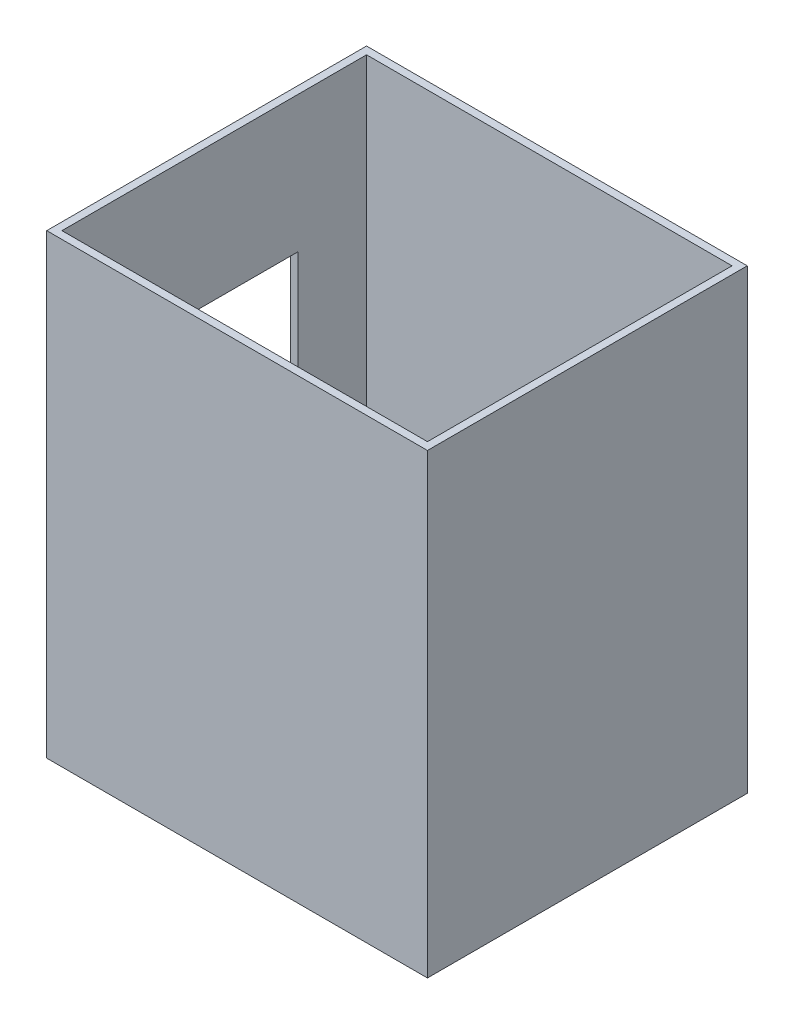
ISO-10303-21;
HEADER;
FILE_DESCRIPTION(('STEP AP214'),'2;1');
FILE_NAME('part.step','',(''),(''),'','','');
FILE_SCHEMA(('AUTOMOTIVE_DESIGN { 1 0 10303 214 1 1 1 1 }'));
ENDSEC;
DATA;
#1=APPLICATION_CONTEXT('core data for automotive mechanical design processes');
#2=APPLICATION_PROTOCOL_DEFINITION('international standard','automotive_design',2000,#1);
#3=PRODUCT_CONTEXT('',#1,'mechanical');
#4=PRODUCT('Part','Part','',(#3));
#5=PRODUCT_RELATED_PRODUCT_CATEGORY('part','',(#4));
#6=PRODUCT_DEFINITION_FORMATION('','',#4);
#7=PRODUCT_DEFINITION_CONTEXT('part definition',#1,'design');
#8=PRODUCT_DEFINITION('design','',#6,#7);
#9=PRODUCT_DEFINITION_SHAPE('','',#8);
#10=(LENGTH_UNIT() NAMED_UNIT(*) SI_UNIT(.MILLI.,.METRE.));
#11=(NAMED_UNIT(*) PLANE_ANGLE_UNIT() SI_UNIT($,.RADIAN.));
#12=(NAMED_UNIT(*) SI_UNIT($,.STERADIAN.) SOLID_ANGLE_UNIT());
#13=UNCERTAINTY_MEASURE_WITH_UNIT(LENGTH_MEASURE(1.E-05),#10,'distance_accuracy_value','');
#14=(GEOMETRIC_REPRESENTATION_CONTEXT(3) GLOBAL_UNCERTAINTY_ASSIGNED_CONTEXT((#13)) GLOBAL_UNIT_ASSIGNED_CONTEXT((#10,
#11,#12)) REPRESENTATION_CONTEXT('',''));
#15=CARTESIAN_POINT('',(0.,0.,0.));
#16=DIRECTION('',(0.,0.,1.));
#17=DIRECTION('',(1.,0.,0.));
#18=AXIS2_PLACEMENT_3D('',#15,#16,#17);
#19=CARTESIAN_POINT('',(-1250.,3000.,1050.));
#20=DIRECTION('',(1.,0.,0.));
#21=DIRECTION('',(0.,0.,-1.));
#22=AXIS2_PLACEMENT_3D('',#19,#20,#21);
#23=PLANE('',#22);
#24=DIRECTION('',(0.,0.,1.));
#25=VECTOR('',#24,1.);
#26=CARTESIAN_POINT('',(-1250.,4.99999999999989,-550.));
#27=LINE('',#26,#25);
#28=CARTESIAN_POINT('',(-1250.,4.99999999999989,-550.));
#29=VERTEX_POINT('',#28);
#30=CARTESIAN_POINT('',(-1250.,4.99999999999989,550.));
#31=VERTEX_POINT('',#30);
#32=EDGE_CURVE('E155',#29,#31,#27,.T.);
#33=ORIENTED_EDGE('',*,*,#32,.F.);
#34=DIRECTION('',(0.,-1.,0.));
#35=VECTOR('',#34,1.);
#36=CARTESIAN_POINT('',(-1250.,2105.,-550.));
#37=LINE('',#36,#35);
#38=CARTESIAN_POINT('',(-1250.,2105.,-550.));
#39=VERTEX_POINT('',#38);
#40=EDGE_CURVE('E47',#39,#29,#37,.T.);
#41=ORIENTED_EDGE('',*,*,#40,.F.);
#42=DIRECTION('',(0.,0.,-1.));
#43=VECTOR('',#42,1.);
#44=CARTESIAN_POINT('',(-1250.,2105.,-550.));
#45=LINE('',#44,#43);
#46=CARTESIAN_POINT('',(-1250.,2105.,550.));
#47=VERTEX_POINT('',#46);
#48=EDGE_CURVE('E136',#47,#39,#45,.T.);
#49=ORIENTED_EDGE('',*,*,#48,.F.);
#50=DIRECTION('',(0.,1.,0.));
#51=VECTOR('',#50,1.);
#52=CARTESIAN_POINT('',(-1250.,2105.,550.));
#53=LINE('',#52,#51);
#54=EDGE_CURVE('E157',#31,#47,#53,.T.);
#55=ORIENTED_EDGE('',*,*,#54,.F.);
#56=EDGE_LOOP('',(#33,#41,#49,#55));
#57=FACE_BOUND('',#56,.T.);
#58=DIRECTION('',(0.,0.,1.));
#59=VECTOR('',#58,1.);
#60=CARTESIAN_POINT('',(-1250.,0.,1050.));
#61=LINE('',#60,#59);
#62=CARTESIAN_POINT('',(-1250.,0.,-1050.));
#63=VERTEX_POINT('',#62);
#64=CARTESIAN_POINT('',(-1250.,0.,1050.));
#65=VERTEX_POINT('',#64);
#66=EDGE_CURVE('E175',#63,#65,#61,.T.);
#67=ORIENTED_EDGE('',*,*,#66,.T.);
#68=DIRECTION('',(0.,-1.,0.));
#69=VECTOR('',#68,1.);
#70=CARTESIAN_POINT('',(-1250.,3000.,1050.));
#71=LINE('',#70,#69);
#72=CARTESIAN_POINT('',(-1250.,3000.,1050.));
#73=VERTEX_POINT('',#72);
#74=EDGE_CURVE('E11',#73,#65,#71,.T.);
#75=ORIENTED_EDGE('',*,*,#74,.F.);
#76=DIRECTION('',(0.,0.,1.));
#77=VECTOR('',#76,1.);
#78=CARTESIAN_POINT('',(-1250.,3000.,1050.));
#79=LINE('',#78,#77);
#80=CARTESIAN_POINT('',(-1250.,3000.,-1050.));
#81=VERTEX_POINT('',#80);
#82=EDGE_CURVE('E199',#81,#73,#79,.T.);
#83=ORIENTED_EDGE('',*,*,#82,.F.);
#84=DIRECTION('',(0.,-1.,0.));
#85=VECTOR('',#84,1.);
#86=CARTESIAN_POINT('',(-1250.,3000.,-1050.));
#87=LINE('',#86,#85);
#88=EDGE_CURVE('E209',#81,#63,#87,.T.);
#89=ORIENTED_EDGE('',*,*,#88,.T.);
#90=EDGE_LOOP('',(#67,#75,#83,#89));
#91=FACE_BOUND('',#90,.T.);
#92=ADVANCED_FACE('F33',(#57,#91),#23,.F.);
#93=CARTESIAN_POINT('',(1250.,3000.,1050.));
#94=DIRECTION('',(0.,0.,-1.));
#95=DIRECTION('',(-1.,0.,0.));
#96=AXIS2_PLACEMENT_3D('',#93,#94,#95);
#97=PLANE('',#96);
#98=DIRECTION('',(1.,0.,0.));
#99=VECTOR('',#98,1.);
#100=CARTESIAN_POINT('',(1250.,0.,1050.));
#101=LINE('',#100,#99);
#102=CARTESIAN_POINT('',(1250.,0.,1050.));
#103=VERTEX_POINT('',#102);
#104=EDGE_CURVE('E212',#65,#103,#101,.T.);
#105=ORIENTED_EDGE('',*,*,#104,.T.);
#106=DIRECTION('',(0.,-1.,0.));
#107=VECTOR('',#106,1.);
#108=CARTESIAN_POINT('',(1250.,3000.,1050.));
#109=LINE('',#108,#107);
#110=CARTESIAN_POINT('',(1250.,3000.,1050.));
#111=VERTEX_POINT('',#110);
#112=EDGE_CURVE('E40',#111,#103,#109,.T.);
#113=ORIENTED_EDGE('',*,*,#112,.F.);
#114=DIRECTION('',(1.,0.,0.));
#115=VECTOR('',#114,1.);
#116=CARTESIAN_POINT('',(1250.,3000.,1050.));
#117=LINE('',#116,#115);
#118=EDGE_CURVE('E202',#73,#111,#117,.T.);
#119=ORIENTED_EDGE('',*,*,#118,.F.);
#120=ORIENTED_EDGE('',*,*,#74,.T.);
#121=EDGE_LOOP('',(#105,#113,#119,#120));
#122=FACE_BOUND('',#121,.T.);
#123=ADVANCED_FACE('F242',(#122),#97,.F.);
#124=CARTESIAN_POINT('',(1250.,3000.,1050.));
#125=DIRECTION('',(-1.,0.,0.));
#126=DIRECTION('',(0.,0.,1.));
#127=AXIS2_PLACEMENT_3D('',#124,#125,#126);
#128=PLANE('',#127);
#129=DIRECTION('',(0.,0.,-1.));
#130=VECTOR('',#129,1.);
#131=CARTESIAN_POINT('',(1250.,0.,1050.));
#132=LINE('',#131,#130);
#133=CARTESIAN_POINT('',(1250.,0.,-1050.));
#134=VERTEX_POINT('',#133);
#135=EDGE_CURVE('E214',#103,#134,#132,.T.);
#136=ORIENTED_EDGE('',*,*,#135,.T.);
#137=DIRECTION('',(0.,-1.,0.));
#138=VECTOR('',#137,1.);
#139=CARTESIAN_POINT('',(1250.,3000.,-1050.));
#140=LINE('',#139,#138);
#141=CARTESIAN_POINT('',(1250.,3000.,-1050.));
#142=VERTEX_POINT('',#141);
#143=EDGE_CURVE('E219',#142,#134,#140,.T.);
#144=ORIENTED_EDGE('',*,*,#143,.F.);
#145=DIRECTION('',(0.,0.,-1.));
#146=VECTOR('',#145,1.);
#147=CARTESIAN_POINT('',(1250.,3000.,1050.));
#148=LINE('',#147,#146);
#149=EDGE_CURVE('E205',#111,#142,#148,.T.);
#150=ORIENTED_EDGE('',*,*,#149,.F.);
#151=ORIENTED_EDGE('',*,*,#112,.T.);
#152=EDGE_LOOP('',(#136,#144,#150,#151));
#153=FACE_BOUND('',#152,.T.);
#154=ADVANCED_FACE('F226',(#153),#128,.F.);
#155=CARTESIAN_POINT('',(1250.,3000.,-1050.));
#156=DIRECTION('',(0.,0.,1.));
#157=DIRECTION('',(1.,0.,0.));
#158=AXIS2_PLACEMENT_3D('',#155,#156,#157);
#159=PLANE('',#158);
#160=DIRECTION('',(-1.,0.,0.));
#161=VECTOR('',#160,1.);
#162=CARTESIAN_POINT('',(1250.,0.,-1050.));
#163=LINE('',#162,#161);
#164=EDGE_CURVE('E203',#134,#63,#163,.T.);
#165=ORIENTED_EDGE('',*,*,#164,.T.);
#166=ORIENTED_EDGE('',*,*,#88,.F.);
#167=DIRECTION('',(-1.,0.,0.));
#168=VECTOR('',#167,1.);
#169=CARTESIAN_POINT('',(1250.,3000.,-1050.));
#170=LINE('',#169,#168);
#171=EDGE_CURVE('E207',#142,#81,#170,.T.);
#172=ORIENTED_EDGE('',*,*,#171,.F.);
#173=ORIENTED_EDGE('',*,*,#143,.T.);
#174=EDGE_LOOP('',(#165,#166,#172,#173));
#175=FACE_BOUND('',#174,.T.);
#176=ADVANCED_FACE('F235',(#175),#159,.F.);
#177=CARTESIAN_POINT('',(0.,3000.,0.));
#178=DIRECTION('',(0.,1.,0.));
#179=DIRECTION('',(0.,0.,1.));
#180=AXIS2_PLACEMENT_3D('',#177,#178,#179);
#181=PLANE('',#180);
#182=DIRECTION('',(0.,0.,1.));
#183=VECTOR('',#182,1.);
#184=CARTESIAN_POINT('',(-1200.,3000.,1050.));
#185=LINE('',#184,#183);
#186=CARTESIAN_POINT('',(-1200.,3000.,-1000.));
#187=VERTEX_POINT('',#186);
#188=CARTESIAN_POINT('',(-1200.,3000.,1000.));
#189=VERTEX_POINT('',#188);
#190=EDGE_CURVE('E191',#187,#189,#185,.T.);
#191=ORIENTED_EDGE('',*,*,#190,.F.);
#192=DIRECTION('',(-1.,0.,0.));
#193=VECTOR('',#192,1.);
#194=CARTESIAN_POINT('',(1250.,3000.,-1000.));
#195=LINE('',#194,#193);
#196=CARTESIAN_POINT('',(1200.,3000.,-1000.));
#197=VERTEX_POINT('',#196);
#198=EDGE_CURVE('E181',#197,#187,#195,.T.);
#199=ORIENTED_EDGE('',*,*,#198,.F.);
#200=DIRECTION('',(0.,0.,-1.));
#201=VECTOR('',#200,1.);
#202=CARTESIAN_POINT('',(1200.,3000.,1050.));
#203=LINE('',#202,#201);
#204=CARTESIAN_POINT('',(1200.,3000.,1000.));
#205=VERTEX_POINT('',#204);
#206=EDGE_CURVE('E195',#205,#197,#203,.T.);
#207=ORIENTED_EDGE('',*,*,#206,.F.);
#208=DIRECTION('',(1.,0.,0.));
#209=VECTOR('',#208,1.);
#210=CARTESIAN_POINT('',(1250.,3000.,1000.));
#211=LINE('',#210,#209);
#212=EDGE_CURVE('E193',#189,#205,#211,.T.);
#213=ORIENTED_EDGE('',*,*,#212,.F.);
#214=EDGE_LOOP('',(#191,#199,#207,#213));
#215=FACE_BOUND('',#214,.T.);
#216=ORIENTED_EDGE('',*,*,#82,.T.);
#217=ORIENTED_EDGE('',*,*,#118,.T.);
#218=ORIENTED_EDGE('',*,*,#149,.T.);
#219=ORIENTED_EDGE('',*,*,#171,.T.);
#220=EDGE_LOOP('',(#216,#217,#218,#219));
#221=FACE_BOUND('',#220,.T.);
#222=ADVANCED_FACE('F241',(#215,#221),#181,.T.);
#223=CARTESIAN_POINT('',(0.,0.,0.));
#224=DIRECTION('',(0.,1.,0.));
#225=DIRECTION('',(0.,0.,1.));
#226=AXIS2_PLACEMENT_3D('',#223,#224,#225);
#227=PLANE('',#226);
#228=ORIENTED_EDGE('',*,*,#66,.F.);
#229=ORIENTED_EDGE('',*,*,#164,.F.);
#230=ORIENTED_EDGE('',*,*,#135,.F.);
#231=ORIENTED_EDGE('',*,*,#104,.F.);
#232=EDGE_LOOP('',(#228,#229,#230,#231));
#233=FACE_BOUND('',#232,.T.);
#234=ADVANCED_FACE('F232',(#233),#227,.F.);
#235=CARTESIAN_POINT('',(-1200.,3000.,1050.));
#236=DIRECTION('',(1.,0.,0.));
#237=DIRECTION('',(0.,0.,-1.));
#238=AXIS2_PLACEMENT_3D('',#235,#236,#237);
#239=PLANE('',#238);
#240=DIRECTION('',(0.,-1.,0.));
#241=VECTOR('',#240,1.);
#242=CARTESIAN_POINT('',(-1200.,2105.,-550.));
#243=LINE('',#242,#241);
#244=CARTESIAN_POINT('',(-1200.,2105.,-550.));
#245=VERTEX_POINT('',#244);
#246=CARTESIAN_POINT('',(-1200.,49.9999999999998,-550.));
#247=VERTEX_POINT('',#246);
#248=EDGE_CURVE('E135',#245,#247,#243,.T.);
#249=ORIENTED_EDGE('',*,*,#248,.T.);
#250=DIRECTION('',(0.,0.,1.));
#251=VECTOR('',#250,1.);
#252=CARTESIAN_POINT('',(-1200.,49.9999999999998,1050.));
#253=LINE('',#252,#251);
#254=CARTESIAN_POINT('',(-1200.,50.,-1000.));
#255=VERTEX_POINT('',#254);
#256=EDGE_CURVE('E168',#255,#247,#253,.T.);
#257=ORIENTED_EDGE('',*,*,#256,.F.);
#258=DIRECTION('',(0.,-1.,0.));
#259=VECTOR('',#258,1.);
#260=CARTESIAN_POINT('',(-1200.,3000.,-1000.));
#261=LINE('',#260,#259);
#262=EDGE_CURVE('E177',#187,#255,#261,.T.);
#263=ORIENTED_EDGE('',*,*,#262,.F.);
#264=ORIENTED_EDGE('',*,*,#190,.T.);
#265=DIRECTION('',(0.,-1.,0.));
#266=VECTOR('',#265,1.);
#267=CARTESIAN_POINT('',(-1200.,3000.,1000.));
#268=LINE('',#267,#266);
#269=CARTESIAN_POINT('',(-1200.,50.,1000.));
#270=VERTEX_POINT('',#269);
#271=EDGE_CURVE('E172',#189,#270,#268,.T.);
#272=ORIENTED_EDGE('',*,*,#271,.T.);
#273=CARTESIAN_POINT('',(-1200.,49.9999999999998,550.));
#274=VERTEX_POINT('',#273);
#275=EDGE_CURVE('E164',#274,#270,#253,.T.);
#276=ORIENTED_EDGE('',*,*,#275,.F.);
#277=DIRECTION('',(0.,1.,0.));
#278=VECTOR('',#277,1.);
#279=CARTESIAN_POINT('',(-1200.,2105.,550.));
#280=LINE('',#279,#278);
#281=CARTESIAN_POINT('',(-1200.,2105.,550.));
#282=VERTEX_POINT('',#281);
#283=EDGE_CURVE('E147',#274,#282,#280,.T.);
#284=ORIENTED_EDGE('',*,*,#283,.T.);
#285=DIRECTION('',(0.,0.,-1.));
#286=VECTOR('',#285,1.);
#287=CARTESIAN_POINT('',(-1200.,2105.,-550.));
#288=LINE('',#287,#286);
#289=EDGE_CURVE('E144',#282,#245,#288,.T.);
#290=ORIENTED_EDGE('',*,*,#289,.T.);
#291=EDGE_LOOP('',(#249,#257,#263,#264,#272,#276,#284,#290));
#292=FACE_BOUND('',#291,.T.);
#293=ADVANCED_FACE('F255',(#292),#239,.T.);
#294=CARTESIAN_POINT('',(1250.,3000.,1000.));
#295=DIRECTION('',(0.,0.,-1.));
#296=DIRECTION('',(-1.,0.,0.));
#297=AXIS2_PLACEMENT_3D('',#294,#295,#296);
#298=PLANE('',#297);
#299=DIRECTION('',(1.,0.,0.));
#300=VECTOR('',#299,1.);
#301=CARTESIAN_POINT('',(1250.,49.9999999999998,1000.));
#302=LINE('',#301,#300);
#303=CARTESIAN_POINT('',(1200.,50.,1000.));
#304=VERTEX_POINT('',#303);
#305=EDGE_CURVE('E171',#270,#304,#302,.T.);
#306=ORIENTED_EDGE('',*,*,#305,.F.);
#307=ORIENTED_EDGE('',*,*,#271,.F.);
#308=ORIENTED_EDGE('',*,*,#212,.T.);
#309=DIRECTION('',(0.,-1.,0.));
#310=VECTOR('',#309,1.);
#311=CARTESIAN_POINT('',(1200.,3000.,1000.));
#312=LINE('',#311,#310);
#313=EDGE_CURVE('E176',#205,#304,#312,.T.);
#314=ORIENTED_EDGE('',*,*,#313,.T.);
#315=EDGE_LOOP('',(#306,#307,#308,#314));
#316=FACE_BOUND('',#315,.T.);
#317=ADVANCED_FACE('F270',(#316),#298,.T.);
#318=CARTESIAN_POINT('',(1200.,3000.,1050.));
#319=DIRECTION('',(-1.,0.,0.));
#320=DIRECTION('',(0.,0.,1.));
#321=AXIS2_PLACEMENT_3D('',#318,#319,#320);
#322=PLANE('',#321);
#323=DIRECTION('',(0.,0.,-1.));
#324=VECTOR('',#323,1.);
#325=CARTESIAN_POINT('',(1200.,49.9999999999998,1050.));
#326=LINE('',#325,#324);
#327=CARTESIAN_POINT('',(1200.,50.,-1000.));
#328=VERTEX_POINT('',#327);
#329=EDGE_CURVE('E183',#304,#328,#326,.T.);
#330=ORIENTED_EDGE('',*,*,#329,.F.);
#331=ORIENTED_EDGE('',*,*,#313,.F.);
#332=ORIENTED_EDGE('',*,*,#206,.T.);
#333=DIRECTION('',(0.,-1.,0.));
#334=VECTOR('',#333,1.);
#335=CARTESIAN_POINT('',(1200.,3000.,-1000.));
#336=LINE('',#335,#334);
#337=EDGE_CURVE('E180',#197,#328,#336,.T.);
#338=ORIENTED_EDGE('',*,*,#337,.T.);
#339=EDGE_LOOP('',(#330,#331,#332,#338));
#340=FACE_BOUND('',#339,.T.);
#341=ADVANCED_FACE('F266',(#340),#322,.T.);
#342=CARTESIAN_POINT('',(1250.,3000.,-1000.));
#343=DIRECTION('',(0.,0.,1.));
#344=DIRECTION('',(1.,0.,0.));
#345=AXIS2_PLACEMENT_3D('',#342,#343,#344);
#346=PLANE('',#345);
#347=DIRECTION('',(-1.,0.,0.));
#348=VECTOR('',#347,1.);
#349=CARTESIAN_POINT('',(1250.,49.9999999999998,-1000.));
#350=LINE('',#349,#348);
#351=EDGE_CURVE('E187',#328,#255,#350,.T.);
#352=ORIENTED_EDGE('',*,*,#351,.F.);
#353=ORIENTED_EDGE('',*,*,#337,.F.);
#354=ORIENTED_EDGE('',*,*,#198,.T.);
#355=ORIENTED_EDGE('',*,*,#262,.T.);
#356=EDGE_LOOP('',(#352,#353,#354,#355));
#357=FACE_BOUND('',#356,.T.);
#358=ADVANCED_FACE('F262',(#357),#346,.T.);
#359=CARTESIAN_POINT('',(0.,50.,0.));
#360=DIRECTION('',(0.,1.,0.));
#361=DIRECTION('',(0.,0.,1.));
#362=AXIS2_PLACEMENT_3D('',#359,#360,#361);
#363=PLANE('',#362);
#364=ORIENTED_EDGE('',*,*,#256,.T.);
#365=EDGE_CURVE('E132',#247,#274,#253,.T.);
#366=ORIENTED_EDGE('',*,*,#365,.T.);
#367=ORIENTED_EDGE('',*,*,#275,.T.);
#368=ORIENTED_EDGE('',*,*,#305,.T.);
#369=ORIENTED_EDGE('',*,*,#329,.T.);
#370=ORIENTED_EDGE('',*,*,#351,.T.);
#371=EDGE_LOOP('',(#364,#366,#367,#368,#369,#370));
#372=FACE_BOUND('',#371,.T.);
#373=ADVANCED_FACE('F259',(#372),#363,.T.);
#374=CARTESIAN_POINT('',(-1200.,2105.,-550.));
#375=DIRECTION('',(0.,0.,-1.));
#376=DIRECTION('',(0.,1.,0.));
#377=AXIS2_PLACEMENT_3D('',#374,#375,#376);
#378=PLANE('',#377);
#379=ORIENTED_EDGE('',*,*,#40,.T.);
#380=DIRECTION('',(-1.,0.,0.));
#381=VECTOR('',#380,1.);
#382=CARTESIAN_POINT('',(-1200.,4.99999999999989,-550.));
#383=LINE('',#382,#381);
#384=CARTESIAN_POINT('',(-1200.,4.99999999999989,-550.));
#385=VERTEX_POINT('',#384);
#386=EDGE_CURVE('E138',#385,#29,#383,.T.);
#387=ORIENTED_EDGE('',*,*,#386,.F.);
#388=EDGE_CURVE('E127',#247,#385,#243,.T.);
#389=ORIENTED_EDGE('',*,*,#388,.F.);
#390=ORIENTED_EDGE('',*,*,#248,.F.);
#391=DIRECTION('',(-1.,0.,0.));
#392=VECTOR('',#391,1.);
#393=CARTESIAN_POINT('',(-1200.,2105.,-550.));
#394=LINE('',#393,#392);
#395=EDGE_CURVE('E162',#245,#39,#394,.T.);
#396=ORIENTED_EDGE('',*,*,#395,.T.);
#397=EDGE_LOOP('',(#379,#387,#389,#390,#396));
#398=FACE_BOUND('',#397,.T.);
#399=ADVANCED_FACE('F139',(#398),#378,.F.);
#400=CARTESIAN_POINT('',(-1200.,2105.,-550.));
#401=DIRECTION('',(0.,1.,0.));
#402=DIRECTION('',(0.,0.,1.));
#403=AXIS2_PLACEMENT_3D('',#400,#401,#402);
#404=PLANE('',#403);
#405=ORIENTED_EDGE('',*,*,#48,.T.);
#406=ORIENTED_EDGE('',*,*,#395,.F.);
#407=ORIENTED_EDGE('',*,*,#289,.F.);
#408=DIRECTION('',(-1.,0.,0.));
#409=VECTOR('',#408,1.);
#410=CARTESIAN_POINT('',(-1200.,2105.,550.));
#411=LINE('',#410,#409);
#412=EDGE_CURVE('E165',#282,#47,#411,.T.);
#413=ORIENTED_EDGE('',*,*,#412,.T.);
#414=EDGE_LOOP('',(#405,#406,#407,#413));
#415=FACE_BOUND('',#414,.T.);
#416=ADVANCED_FACE('F280',(#415),#404,.F.);
#417=CARTESIAN_POINT('',(-1200.,2105.,550.));
#418=DIRECTION('',(0.,0.,1.));
#419=DIRECTION('',(0.,-1.,0.));
#420=AXIS2_PLACEMENT_3D('',#417,#418,#419);
#421=PLANE('',#420);
#422=ORIENTED_EDGE('',*,*,#54,.T.);
#423=ORIENTED_EDGE('',*,*,#412,.F.);
#424=ORIENTED_EDGE('',*,*,#283,.F.);
#425=CARTESIAN_POINT('',(-1200.,4.99999999999989,550.));
#426=VERTEX_POINT('',#425);
#427=EDGE_CURVE('E55',#426,#274,#280,.T.);
#428=ORIENTED_EDGE('',*,*,#427,.F.);
#429=DIRECTION('',(-1.,0.,0.));
#430=VECTOR('',#429,1.);
#431=CARTESIAN_POINT('',(-1200.,4.99999999999989,550.));
#432=LINE('',#431,#430);
#433=EDGE_CURVE('E143',#426,#31,#432,.T.);
#434=ORIENTED_EDGE('',*,*,#433,.T.);
#435=EDGE_LOOP('',(#422,#423,#424,#428,#434));
#436=FACE_BOUND('',#435,.T.);
#437=ADVANCED_FACE('F283',(#436),#421,.F.);
#438=CARTESIAN_POINT('',(-1200.,4.99999999999989,-550.));
#439=DIRECTION('',(0.,-1.,0.));
#440=DIRECTION('',(0.,0.,-1.));
#441=AXIS2_PLACEMENT_3D('',#438,#439,#440);
#442=PLANE('',#441);
#443=ORIENTED_EDGE('',*,*,#32,.T.);
#444=ORIENTED_EDGE('',*,*,#433,.F.);
#445=DIRECTION('',(0.,0.,1.));
#446=VECTOR('',#445,1.);
#447=CARTESIAN_POINT('',(-1200.,4.99999999999989,-550.));
#448=LINE('',#447,#446);
#449=EDGE_CURVE('E130',#385,#426,#448,.T.);
#450=ORIENTED_EDGE('',*,*,#449,.F.);
#451=ORIENTED_EDGE('',*,*,#386,.T.);
#452=EDGE_LOOP('',(#443,#444,#450,#451));
#453=FACE_BOUND('',#452,.T.);
#454=ADVANCED_FACE('F146',(#453),#442,.F.);
#455=CARTESIAN_POINT('',(-1200.,0.,0.));
#456=DIRECTION('',(-1.,0.,0.));
#457=DIRECTION('',(0.,0.,1.));
#458=AXIS2_PLACEMENT_3D('',#455,#456,#457);
#459=PLANE('',#458);
#460=ORIENTED_EDGE('',*,*,#388,.T.);
#461=ORIENTED_EDGE('',*,*,#449,.T.);
#462=ORIENTED_EDGE('',*,*,#427,.T.);
#463=ORIENTED_EDGE('',*,*,#365,.F.);
#464=EDGE_LOOP('',(#460,#461,#462,#463));
#465=FACE_BOUND('',#464,.T.);
#466=ADVANCED_FACE('F128',(#465),#459,.T.);
#467=CLOSED_SHELL('',(#92,#123,#154,#176,#222,#234,#293,#317,#341,#358,#373,#399,#416,#437,#454,#466));
#468=MANIFOLD_SOLID_BREP('B2',#467);
#469=ADVANCED_BREP_SHAPE_REPRESENTATION('',(#18,#468),#14);
#470=SHAPE_DEFINITION_REPRESENTATION(#9,#469);
ENDSEC;
END-ISO-10303-21;
